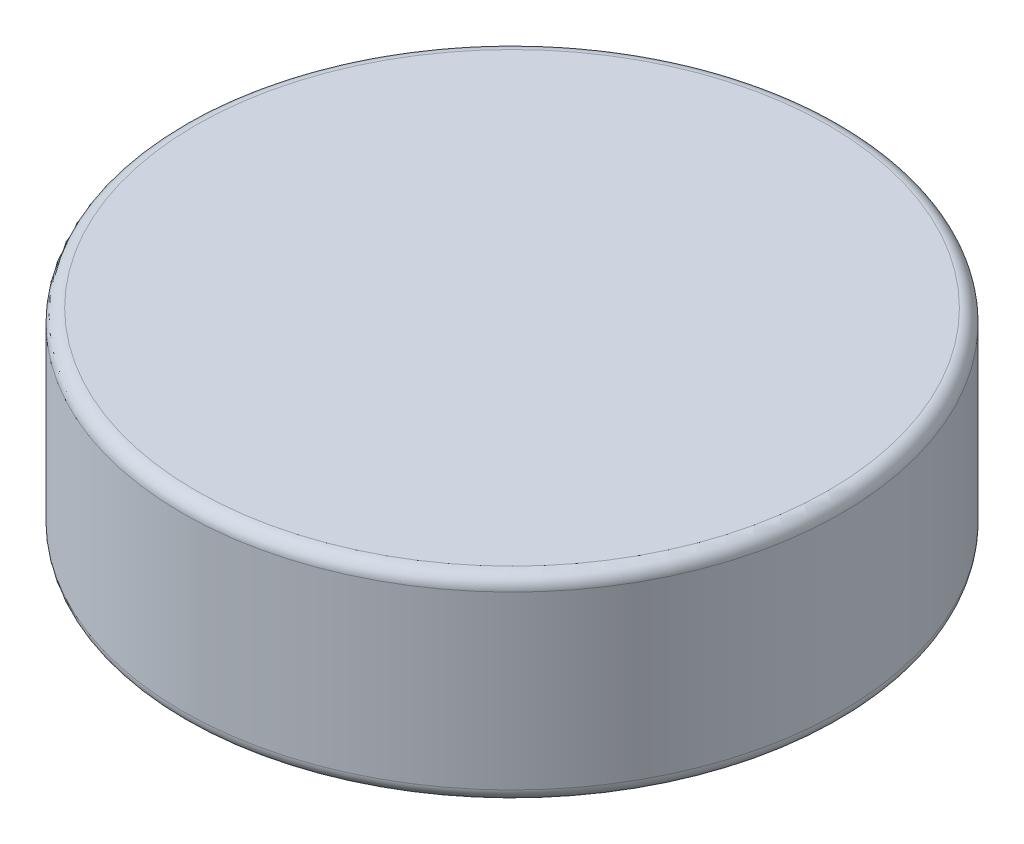
ISO-10303-21;
HEADER;
FILE_DESCRIPTION(('STEP AP214'),'2;1');
FILE_NAME('part.step','',(''),(''),'','','');
FILE_SCHEMA(('AUTOMOTIVE_DESIGN { 1 0 10303 214 1 1 1 1 }'));
ENDSEC;
DATA;
#1=APPLICATION_CONTEXT('core data for automotive mechanical design processes');
#2=APPLICATION_PROTOCOL_DEFINITION('international standard','automotive_design',2000,#1);
#3=PRODUCT_CONTEXT('',#1,'mechanical');
#4=PRODUCT('Part','Part','',(#3));
#5=PRODUCT_RELATED_PRODUCT_CATEGORY('part','',(#4));
#6=PRODUCT_DEFINITION_FORMATION('','',#4);
#7=PRODUCT_DEFINITION_CONTEXT('part definition',#1,'design');
#8=PRODUCT_DEFINITION('design','',#6,#7);
#9=PRODUCT_DEFINITION_SHAPE('','',#8);
#10=(LENGTH_UNIT() NAMED_UNIT(*) SI_UNIT(.MILLI.,.METRE.));
#11=(NAMED_UNIT(*) PLANE_ANGLE_UNIT() SI_UNIT($,.RADIAN.));
#12=(NAMED_UNIT(*) SI_UNIT($,.STERADIAN.) SOLID_ANGLE_UNIT());
#13=UNCERTAINTY_MEASURE_WITH_UNIT(LENGTH_MEASURE(1.E-05),#10,'distance_accuracy_value','');
#14=(GEOMETRIC_REPRESENTATION_CONTEXT(3) GLOBAL_UNCERTAINTY_ASSIGNED_CONTEXT((#13)) GLOBAL_UNIT_ASSIGNED_CONTEXT((#10,
#11,#12)) REPRESENTATION_CONTEXT('',''));
#15=CARTESIAN_POINT('',(0.,0.,0.));
#16=DIRECTION('',(0.,0.,1.));
#17=DIRECTION('',(1.,0.,0.));
#18=AXIS2_PLACEMENT_3D('',#15,#16,#17);
#19=CARTESIAN_POINT('',(0.,1.5,0.));
#20=DIRECTION('',(0.,-1.,0.));
#21=DIRECTION('',(0.,0.,-1.));
#22=AXIS2_PLACEMENT_3D('',#19,#20,#21);
#23=CYLINDRICAL_SURFACE('',#22,5.);
#24=CARTESIAN_POINT('',(0.,-1.3,0.));
#25=DIRECTION('',(0.,1.,0.));
#26=DIRECTION('',(0.,0.,1.));
#27=AXIS2_PLACEMENT_3D('',#24,#25,#26);
#28=CIRCLE('',#27,5.);
#29=CARTESIAN_POINT('',(0.,-1.3,5.));
#30=VERTEX_POINT('',#29);
#31=EDGE_CURVE('E47',#30,#30,#28,.T.);
#32=ORIENTED_EDGE('',*,*,#31,.T.);
#33=EDGE_LOOP('',(#32));
#34=FACE_BOUND('',#33,.T.);
#35=CARTESIAN_POINT('',(0.,1.3,0.));
#36=DIRECTION('',(0.,1.,0.));
#37=DIRECTION('',(0.,0.,1.));
#38=AXIS2_PLACEMENT_3D('',#35,#36,#37);
#39=CIRCLE('',#38,5.);
#40=CARTESIAN_POINT('',(0.,1.3,5.));
#41=VERTEX_POINT('',#40);
#42=EDGE_CURVE('E51',#41,#41,#39,.F.);
#43=ORIENTED_EDGE('',*,*,#42,.T.);
#44=EDGE_LOOP('',(#43));
#45=FACE_BOUND('',#44,.T.);
#46=ADVANCED_FACE('F36',(#34,#45),#23,.T.);
#47=CARTESIAN_POINT('',(0.,1.5,0.));
#48=DIRECTION('',(0.,1.,0.));
#49=DIRECTION('',(0.,0.,1.));
#50=AXIS2_PLACEMENT_3D('',#47,#48,#49);
#51=PLANE('',#50);
#52=CARTESIAN_POINT('',(0.,1.5,0.));
#53=DIRECTION('',(0.,1.,0.));
#54=DIRECTION('',(0.,0.,1.));
#55=AXIS2_PLACEMENT_3D('',#52,#53,#54);
#56=CIRCLE('',#55,4.8);
#57=CARTESIAN_POINT('',(0.,1.5,4.8));
#58=VERTEX_POINT('',#57);
#59=EDGE_CURVE('E10',#58,#58,#56,.T.);
#60=ORIENTED_EDGE('',*,*,#59,.T.);
#61=EDGE_LOOP('',(#60));
#62=FACE_BOUND('',#61,.T.);
#63=ADVANCED_FACE('F67',(#62),#51,.T.);
#64=CARTESIAN_POINT('',(0.,-1.5,0.));
#65=DIRECTION('',(0.,1.,0.));
#66=DIRECTION('',(0.,0.,1.));
#67=AXIS2_PLACEMENT_3D('',#64,#65,#66);
#68=PLANE('',#67);
#69=CARTESIAN_POINT('',(0.,-1.5,0.));
#70=DIRECTION('',(0.,1.,0.));
#71=DIRECTION('',(0.,0.,1.));
#72=AXIS2_PLACEMENT_3D('',#69,#70,#71);
#73=CIRCLE('',#72,4.8);
#74=CARTESIAN_POINT('',(0.,-1.5,4.8));
#75=VERTEX_POINT('',#74);
#76=EDGE_CURVE('E43',#75,#75,#73,.F.);
#77=ORIENTED_EDGE('',*,*,#76,.T.);
#78=EDGE_LOOP('',(#77));
#79=FACE_BOUND('',#78,.T.);
#80=ADVANCED_FACE('F64',(#79),#68,.F.);
#81=CARTESIAN_POINT('',(0.,-1.3,0.));
#82=DIRECTION('',(0.,1.,0.));
#83=DIRECTION('',(0.,0.,1.));
#84=AXIS2_PLACEMENT_3D('',#81,#82,#83);
#85=TOROIDAL_SURFACE('',#84,4.8,0.2);
#86=ORIENTED_EDGE('',*,*,#76,.F.);
#87=EDGE_LOOP('',(#86));
#88=FACE_BOUND('',#87,.T.);
#89=ORIENTED_EDGE('',*,*,#31,.F.);
#90=EDGE_LOOP('',(#89));
#91=FACE_BOUND('',#90,.T.);
#92=ADVANCED_FACE('F60',(#88,#91),#85,.T.);
#93=CARTESIAN_POINT('',(0.,1.3,0.));
#94=DIRECTION('',(0.,1.,0.));
#95=DIRECTION('',(0.,0.,1.));
#96=AXIS2_PLACEMENT_3D('',#93,#94,#95);
#97=TOROIDAL_SURFACE('',#96,4.8,0.2);
#98=ORIENTED_EDGE('',*,*,#42,.F.);
#99=EDGE_LOOP('',(#98));
#100=FACE_BOUND('',#99,.T.);
#101=ORIENTED_EDGE('',*,*,#59,.F.);
#102=EDGE_LOOP('',(#101));
#103=FACE_BOUND('',#102,.T.);
#104=ADVANCED_FACE('F38',(#100,#103),#97,.T.);
#105=CLOSED_SHELL('',(#46,#63,#80,#92,#104));
#106=MANIFOLD_SOLID_BREP('B2',#105);
#107=ADVANCED_BREP_SHAPE_REPRESENTATION('',(#18,#106),#14);
#108=SHAPE_DEFINITION_REPRESENTATION(#9,#107);
ENDSEC;
END-ISO-10303-21;
